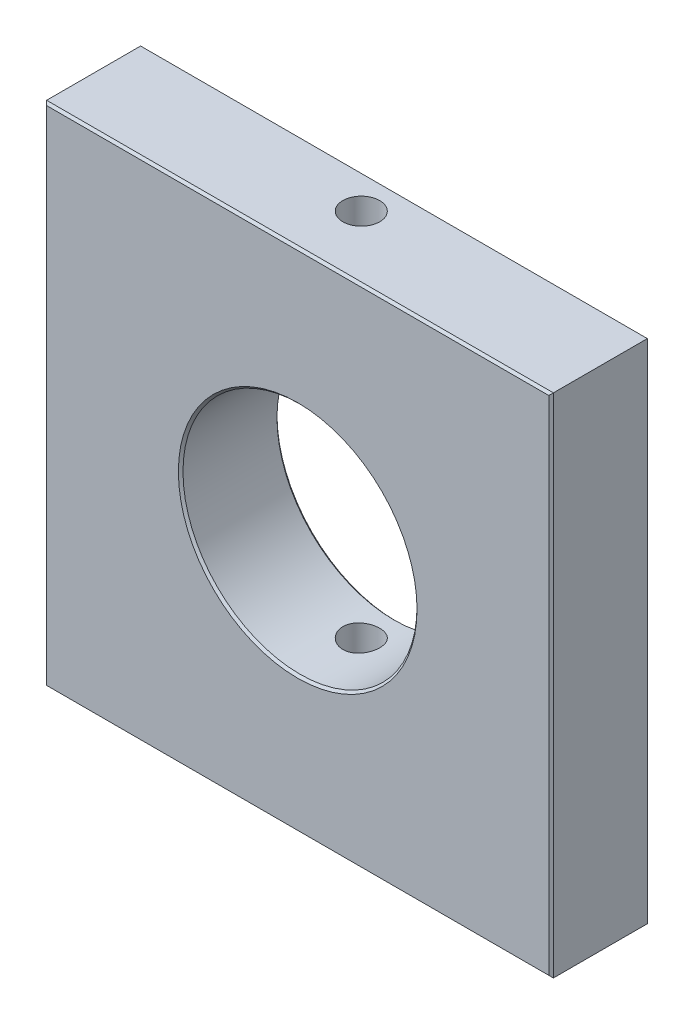
ISO-10303-21;
HEADER;
FILE_DESCRIPTION(('STEP AP214'),'2;1');
FILE_NAME('part.step','',(''),(''),'','','');
FILE_SCHEMA(('AUTOMOTIVE_DESIGN { 1 0 10303 214 1 1 1 1 }'));
ENDSEC;
DATA;
#1=APPLICATION_CONTEXT('core data for automotive mechanical design processes');
#2=APPLICATION_PROTOCOL_DEFINITION('international standard','automotive_design',2000,#1);
#3=PRODUCT_CONTEXT('',#1,'mechanical');
#4=PRODUCT('Part','Part','',(#3));
#5=PRODUCT_RELATED_PRODUCT_CATEGORY('part','',(#4));
#6=PRODUCT_DEFINITION_FORMATION('','',#4);
#7=PRODUCT_DEFINITION_CONTEXT('part definition',#1,'design');
#8=PRODUCT_DEFINITION('design','',#6,#7);
#9=PRODUCT_DEFINITION_SHAPE('','',#8);
#10=(LENGTH_UNIT() NAMED_UNIT(*) SI_UNIT(.MILLI.,.METRE.));
#11=(NAMED_UNIT(*) PLANE_ANGLE_UNIT() SI_UNIT($,.RADIAN.));
#12=(NAMED_UNIT(*) SI_UNIT($,.STERADIAN.) SOLID_ANGLE_UNIT());
#13=UNCERTAINTY_MEASURE_WITH_UNIT(LENGTH_MEASURE(1.E-05),#10,'distance_accuracy_value','');
#14=(GEOMETRIC_REPRESENTATION_CONTEXT(3) GLOBAL_UNCERTAINTY_ASSIGNED_CONTEXT((#13)) GLOBAL_UNIT_ASSIGNED_CONTEXT((#10,
#11,#12)) REPRESENTATION_CONTEXT('',''));
#15=CARTESIAN_POINT('',(0.,0.,0.));
#16=DIRECTION('',(0.,0.,1.));
#17=DIRECTION('',(1.,0.,0.));
#18=AXIS2_PLACEMENT_3D('',#15,#16,#17);
#19=CARTESIAN_POINT('',(0.,0.,10.7));
#20=DIRECTION('',(0.,0.,-1.));
#21=DIRECTION('',(-1.,0.,0.));
#22=AXIS2_PLACEMENT_3D('',#19,#20,#21);
#23=PLANE('',#22);
#24=CARTESIAN_POINT('',(0.,0.,10.7));
#25=DIRECTION('',(0.,0.,-1.));
#26=DIRECTION('',(-1.,0.,0.));
#27=AXIS2_PLACEMENT_3D('',#24,#25,#26);
#28=CIRCLE('',#27,12.95);
#29=CARTESIAN_POINT('',(-12.95,0.,10.7));
#30=VERTEX_POINT('',#29);
#31=EDGE_CURVE('E11',#30,#30,#28,.T.);
#32=ORIENTED_EDGE('',*,*,#31,.T.);
#33=EDGE_LOOP('',(#32));
#34=FACE_BOUND('',#33,.T.);
#35=DIRECTION('',(0.,-1.,0.));
#36=VECTOR('',#35,1.);
#37=CARTESIAN_POINT('',(-27.25,0.,10.7));
#38=LINE('',#37,#36);
#39=CARTESIAN_POINT('',(-27.25,27.25,10.7));
#40=VERTEX_POINT('',#39);
#41=CARTESIAN_POINT('',(-27.25,-27.25,10.7));
#42=VERTEX_POINT('',#41);
#43=EDGE_CURVE('E60',#40,#42,#38,.T.);
#44=ORIENTED_EDGE('',*,*,#43,.T.);
#45=DIRECTION('',(1.,0.,0.));
#46=VECTOR('',#45,1.);
#47=CARTESIAN_POINT('',(0.,-27.25,10.7));
#48=LINE('',#47,#46);
#49=CARTESIAN_POINT('',(27.25,-27.25,10.7));
#50=VERTEX_POINT('',#49);
#51=EDGE_CURVE('E52',#42,#50,#48,.T.);
#52=ORIENTED_EDGE('',*,*,#51,.T.);
#53=DIRECTION('',(0.,1.,0.));
#54=VECTOR('',#53,1.);
#55=CARTESIAN_POINT('',(27.25,0.,10.7));
#56=LINE('',#55,#54);
#57=CARTESIAN_POINT('',(27.25,27.25,10.7));
#58=VERTEX_POINT('',#57);
#59=EDGE_CURVE('E181',#50,#58,#56,.T.);
#60=ORIENTED_EDGE('',*,*,#59,.T.);
#61=DIRECTION('',(-1.,0.,0.));
#62=VECTOR('',#61,1.);
#63=CARTESIAN_POINT('',(0.,27.25,10.7));
#64=LINE('',#63,#62);
#65=EDGE_CURVE('E65',#58,#40,#64,.T.);
#66=ORIENTED_EDGE('',*,*,#65,.T.);
#67=EDGE_LOOP('',(#44,#52,#60,#66));
#68=FACE_BOUND('',#67,.T.);
#69=ADVANCED_FACE('F41',(#34,#68),#23,.F.);
#70=CARTESIAN_POINT('',(0.,0.,0.));
#71=DIRECTION('',(0.,0.,-1.));
#72=DIRECTION('',(-1.,0.,0.));
#73=AXIS2_PLACEMENT_3D('',#70,#71,#72);
#74=PLANE('',#73);
#75=CARTESIAN_POINT('',(0.,0.,0.));
#76=DIRECTION('',(0.,0.,-1.));
#77=DIRECTION('',(-1.,0.,0.));
#78=AXIS2_PLACEMENT_3D('',#75,#76,#77);
#79=CIRCLE('',#78,12.95);
#80=CARTESIAN_POINT('',(-12.95,0.,0.));
#81=VERTEX_POINT('',#80);
#82=EDGE_CURVE('E140',#81,#81,#79,.F.);
#83=ORIENTED_EDGE('',*,*,#82,.T.);
#84=EDGE_LOOP('',(#83));
#85=FACE_BOUND('',#84,.T.);
#86=DIRECTION('',(0.,1.,0.));
#87=VECTOR('',#86,1.);
#88=CARTESIAN_POINT('',(-27.25,27.5,0.));
#89=LINE('',#88,#87);
#90=CARTESIAN_POINT('',(-27.25,-27.25,0.));
#91=VERTEX_POINT('',#90);
#92=CARTESIAN_POINT('',(-27.25,27.25,0.));
#93=VERTEX_POINT('',#92);
#94=EDGE_CURVE('E138',#91,#93,#89,.T.);
#95=ORIENTED_EDGE('',*,*,#94,.T.);
#96=DIRECTION('',(1.,0.,0.));
#97=VECTOR('',#96,1.);
#98=CARTESIAN_POINT('',(27.5,27.25,0.));
#99=LINE('',#98,#97);
#100=CARTESIAN_POINT('',(27.25,27.25,0.));
#101=VERTEX_POINT('',#100);
#102=EDGE_CURVE('E115',#93,#101,#99,.T.);
#103=ORIENTED_EDGE('',*,*,#102,.T.);
#104=DIRECTION('',(0.,-1.,0.));
#105=VECTOR('',#104,1.);
#106=CARTESIAN_POINT('',(27.25,-27.5,0.));
#107=LINE('',#106,#105);
#108=CARTESIAN_POINT('',(27.25,-27.25,0.));
#109=VERTEX_POINT('',#108);
#110=EDGE_CURVE('E126',#101,#109,#107,.T.);
#111=ORIENTED_EDGE('',*,*,#110,.T.);
#112=DIRECTION('',(-1.,0.,0.));
#113=VECTOR('',#112,1.);
#114=CARTESIAN_POINT('',(-27.5,-27.25,0.));
#115=LINE('',#114,#113);
#116=EDGE_CURVE('E133',#109,#91,#115,.T.);
#117=ORIENTED_EDGE('',*,*,#116,.T.);
#118=EDGE_LOOP('',(#95,#103,#111,#117));
#119=FACE_BOUND('',#118,.T.);
#120=ADVANCED_FACE('F136',(#85,#119),#74,.T.);
#121=CARTESIAN_POINT('',(27.5,-27.5,10.7));
#122=DIRECTION('',(-1.,0.,0.));
#123=DIRECTION('',(0.,0.,1.));
#124=AXIS2_PLACEMENT_3D('',#121,#122,#123);
#125=PLANE('',#124);
#126=DIRECTION('',(0.,0.,-1.));
#127=VECTOR('',#126,1.);
#128=CARTESIAN_POINT('',(27.5,-27.5,10.7));
#129=LINE('',#128,#127);
#130=CARTESIAN_POINT('',(27.5,-27.5,10.45));
#131=VERTEX_POINT('',#130);
#132=CARTESIAN_POINT('',(27.5,-27.5,0.25));
#133=VERTEX_POINT('',#132);
#134=EDGE_CURVE('E460',#131,#133,#129,.T.);
#135=ORIENTED_EDGE('',*,*,#134,.T.);
#136=DIRECTION('',(0.,1.,0.));
#137=VECTOR('',#136,1.);
#138=CARTESIAN_POINT('',(27.5,27.5,0.25));
#139=LINE('',#138,#137);
#140=CARTESIAN_POINT('',(27.5,27.5,0.25));
#141=VERTEX_POINT('',#140);
#142=EDGE_CURVE('E178',#133,#141,#139,.T.);
#143=ORIENTED_EDGE('',*,*,#142,.T.);
#144=DIRECTION('',(0.,0.,-1.));
#145=VECTOR('',#144,1.);
#146=CARTESIAN_POINT('',(27.5,27.5,10.7));
#147=LINE('',#146,#145);
#148=CARTESIAN_POINT('',(27.5,27.5,10.45));
#149=VERTEX_POINT('',#148);
#150=EDGE_CURVE('E134',#149,#141,#147,.T.);
#151=ORIENTED_EDGE('',*,*,#150,.F.);
#152=DIRECTION('',(0.,-1.,0.));
#153=VECTOR('',#152,1.);
#154=CARTESIAN_POINT('',(27.5,-27.5,10.45));
#155=LINE('',#154,#153);
#156=EDGE_CURVE('E175',#149,#131,#155,.T.);
#157=ORIENTED_EDGE('',*,*,#156,.T.);
#158=EDGE_LOOP('',(#135,#143,#151,#157));
#159=FACE_BOUND('',#158,.T.);
#160=ADVANCED_FACE('F226',(#159),#125,.F.);
#161=CARTESIAN_POINT('',(-27.5,27.5,10.7));
#162=DIRECTION('',(0.,-1.,0.));
#163=DIRECTION('',(0.,0.,-1.));
#164=AXIS2_PLACEMENT_3D('',#161,#162,#163);
#165=PLANE('',#164);
#166=CARTESIAN_POINT('',(0.,27.5,3.8));
#167=DIRECTION('',(0.,1.,0.));
#168=DIRECTION('',(0.,0.,1.));
#169=AXIS2_PLACEMENT_3D('',#166,#167,#168);
#170=CIRCLE('',#169,2.);
#171=CARTESIAN_POINT('',(0.,27.5,5.8));
#172=VERTEX_POINT('',#171);
#173=EDGE_CURVE('E197',#172,#172,#170,.T.);
#174=ORIENTED_EDGE('',*,*,#173,.F.);
#175=EDGE_LOOP('',(#174));
#176=FACE_BOUND('',#175,.T.);
#177=ORIENTED_EDGE('',*,*,#150,.T.);
#178=DIRECTION('',(-1.,0.,0.));
#179=VECTOR('',#178,1.);
#180=CARTESIAN_POINT('',(-27.5,27.5,0.25));
#181=LINE('',#180,#179);
#182=CARTESIAN_POINT('',(-27.5,27.5,0.25));
#183=VERTEX_POINT('',#182);
#184=EDGE_CURVE('E118',#141,#183,#181,.T.);
#185=ORIENTED_EDGE('',*,*,#184,.T.);
#186=DIRECTION('',(0.,0.,-1.));
#187=VECTOR('',#186,1.);
#188=CARTESIAN_POINT('',(-27.5,27.5,10.7));
#189=LINE('',#188,#187);
#190=CARTESIAN_POINT('',(-27.5,27.5,10.45));
#191=VERTEX_POINT('',#190);
#192=EDGE_CURVE('E223',#191,#183,#189,.T.);
#193=ORIENTED_EDGE('',*,*,#192,.F.);
#194=DIRECTION('',(1.,0.,0.));
#195=VECTOR('',#194,1.);
#196=CARTESIAN_POINT('',(-27.5,27.5,10.45));
#197=LINE('',#196,#195);
#198=EDGE_CURVE('E157',#191,#149,#197,.T.);
#199=ORIENTED_EDGE('',*,*,#198,.T.);
#200=EDGE_LOOP('',(#177,#185,#193,#199));
#201=FACE_BOUND('',#200,.T.);
#202=ADVANCED_FACE('F221',(#176,#201),#165,.F.);
#203=CARTESIAN_POINT('',(-27.5,-27.5,10.7));
#204=DIRECTION('',(1.,0.,0.));
#205=DIRECTION('',(0.,0.,-1.));
#206=AXIS2_PLACEMENT_3D('',#203,#204,#205);
#207=PLANE('',#206);
#208=ORIENTED_EDGE('',*,*,#192,.T.);
#209=DIRECTION('',(0.,-1.,0.));
#210=VECTOR('',#209,1.);
#211=CARTESIAN_POINT('',(-27.5,-27.5,0.25));
#212=LINE('',#211,#210);
#213=CARTESIAN_POINT('',(-27.5,-27.5,0.25));
#214=VERTEX_POINT('',#213);
#215=EDGE_CURVE('E165',#183,#214,#212,.T.);
#216=ORIENTED_EDGE('',*,*,#215,.T.);
#217=DIRECTION('',(0.,0.,-1.));
#218=VECTOR('',#217,1.);
#219=CARTESIAN_POINT('',(-27.5,-27.5,10.7));
#220=LINE('',#219,#218);
#221=CARTESIAN_POINT('',(-27.5,-27.5,10.45));
#222=VERTEX_POINT('',#221);
#223=EDGE_CURVE('E231',#222,#214,#220,.T.);
#224=ORIENTED_EDGE('',*,*,#223,.F.);
#225=DIRECTION('',(0.,1.,0.));
#226=VECTOR('',#225,1.);
#227=CARTESIAN_POINT('',(-27.5,-27.5,10.45));
#228=LINE('',#227,#226);
#229=EDGE_CURVE('E162',#222,#191,#228,.T.);
#230=ORIENTED_EDGE('',*,*,#229,.T.);
#231=EDGE_LOOP('',(#208,#216,#224,#230));
#232=FACE_BOUND('',#231,.T.);
#233=ADVANCED_FACE('F277',(#232),#207,.F.);
#234=CARTESIAN_POINT('',(-27.5,-27.5,10.7));
#235=DIRECTION('',(0.,1.,0.));
#236=DIRECTION('',(0.,0.,1.));
#237=AXIS2_PLACEMENT_3D('',#234,#235,#236);
#238=PLANE('',#237);
#239=CARTESIAN_POINT('',(0.,-27.5,3.8));
#240=DIRECTION('',(0.,1.,0.));
#241=DIRECTION('',(0.,0.,1.));
#242=AXIS2_PLACEMENT_3D('',#239,#240,#241);
#243=CIRCLE('',#242,2.);
#244=CARTESIAN_POINT('',(0.,-27.5,5.8));
#245=VERTEX_POINT('',#244);
#246=EDGE_CURVE('E245',#245,#245,#243,.T.);
#247=ORIENTED_EDGE('',*,*,#246,.T.);
#248=EDGE_LOOP('',(#247));
#249=FACE_BOUND('',#248,.T.);
#250=ORIENTED_EDGE('',*,*,#223,.T.);
#251=DIRECTION('',(1.,0.,0.));
#252=VECTOR('',#251,1.);
#253=CARTESIAN_POINT('',(27.5,-27.5,0.25));
#254=LINE('',#253,#252);
#255=EDGE_CURVE('E172',#214,#133,#254,.T.);
#256=ORIENTED_EDGE('',*,*,#255,.T.);
#257=ORIENTED_EDGE('',*,*,#134,.F.);
#258=DIRECTION('',(-1.,0.,0.));
#259=VECTOR('',#258,1.);
#260=CARTESIAN_POINT('',(-27.5,-27.5,10.45));
#261=LINE('',#260,#259);
#262=EDGE_CURVE('E168',#131,#222,#261,.T.);
#263=ORIENTED_EDGE('',*,*,#262,.T.);
#264=EDGE_LOOP('',(#250,#256,#257,#263));
#265=FACE_BOUND('',#264,.T.);
#266=ADVANCED_FACE('F264',(#249,#265),#238,.F.);
#267=CARTESIAN_POINT('',(0.,0.,10.7));
#268=DIRECTION('',(0.,0.,-1.));
#269=DIRECTION('',(-1.,0.,0.));
#270=AXIS2_PLACEMENT_3D('',#267,#268,#269);
#271=CYLINDRICAL_SURFACE('',#270,12.7);
#272=CARTESIAN_POINT('',(0.,0.,0.250000000000011));
#273=DIRECTION('',(0.,0.,-1.));
#274=DIRECTION('',(-1.,0.,0.));
#275=AXIS2_PLACEMENT_3D('',#272,#273,#274);
#276=CIRCLE('',#275,12.7);
#277=CARTESIAN_POINT('',(-12.7,0.,0.250000000000011));
#278=VERTEX_POINT('',#277);
#279=EDGE_CURVE('E153',#278,#278,#276,.T.);
#280=ORIENTED_EDGE('',*,*,#279,.T.);
#281=EDGE_LOOP('',(#280));
#282=FACE_BOUND('',#281,.T.);
#283=CARTESIAN_POINT('',(0.,0.,10.45));
#284=DIRECTION('',(0.,0.,-1.));
#285=DIRECTION('',(-1.,0.,0.));
#286=AXIS2_PLACEMENT_3D('',#283,#284,#285);
#287=CIRCLE('',#286,12.7);
#288=CARTESIAN_POINT('',(-12.7,0.,10.45));
#289=VERTEX_POINT('',#288);
#290=EDGE_CURVE('E145',#289,#289,#287,.F.);
#291=ORIENTED_EDGE('',*,*,#290,.T.);
#292=EDGE_LOOP('',(#291));
#293=FACE_BOUND('',#292,.T.);
#294=CARTESIAN_POINT('',(0.,-12.7,5.8));
#295=CARTESIAN_POINT('',(0.111600664148431,-12.6999981524228,5.79999545104187));
#296=CARTESIAN_POINT('',(0.223264408691944,-12.6985135958241,5.79062742468302));
#297=CARTESIAN_POINT('',(0.443466081735364,-12.6927343158842,5.75341497965549));
#298=CARTESIAN_POINT('',(0.552000938104321,-12.688436922686,5.72555300675381));
#299=CARTESIAN_POINT('',(0.762726600203343,-12.6775144984945,5.65220975884927));
#300=CARTESIAN_POINT('',(0.864922301127025,-12.6708912905376,5.60674228065987));
#301=CARTESIAN_POINT('',(1.06021942005788,-12.656047516791,5.49951346482873));
#302=CARTESIAN_POINT('',(1.15332200133802,-12.6478271557265,5.43775421512671));
#303=CARTESIAN_POINT('',(1.32860297056712,-12.6306231344999,5.2991310475032));
#304=CARTESIAN_POINT('',(1.41069206722919,-12.6216341021079,5.22215488066347));
#305=CARTESIAN_POINT('',(1.56084506439828,-12.6039474984593,5.05552453918275));
#306=CARTESIAN_POINT('',(1.62890812473979,-12.5952499446885,4.96586960562036));
#307=CARTESIAN_POINT('',(1.74942910866078,-12.5790789996388,4.77582082402101));
#308=CARTESIAN_POINT('',(1.80179980015071,-12.5716125514922,4.67537101488049));
#309=CARTESIAN_POINT('',(1.88889181156734,-12.5588230882536,4.46696339355125));
#310=CARTESIAN_POINT('',(1.9236141931795,-12.5534999442289,4.3590060334454));
#311=CARTESIAN_POINT('',(1.97414485466214,-12.5456529167489,4.13959024617506));
#312=CARTESIAN_POINT('',(1.99010658054076,-12.5431063360034,4.02816798385193));
#313=CARTESIAN_POINT('',(2.00313837228686,-12.5410319744817,3.80419971379784));
#314=CARTESIAN_POINT('',(2.00020963248389,-12.5415040028571,3.69165377755916));
#315=CARTESIAN_POINT('',(1.97566884734412,-12.5453927846462,3.46972184809287));
#316=CARTESIAN_POINT('',(1.9542283431422,-12.5487825001334,3.3603163438682));
#317=CARTESIAN_POINT('',(1.89354147195399,-12.5580824469318,3.14667521604141));
#318=CARTESIAN_POINT('',(1.85429455435304,-12.563992756185,3.04243975241923));
#319=CARTESIAN_POINT('',(1.75893248532883,-12.5776975271031,2.84157930504981));
#320=CARTESIAN_POINT('',(1.70274529763056,-12.5855000066881,2.74498909131562));
#321=CARTESIAN_POINT('',(1.57514886920774,-12.6021042826765,2.56254284319698));
#322=CARTESIAN_POINT('',(1.50373852907517,-12.6109061512339,2.4766875847962));
#323=CARTESIAN_POINT('',(1.34678429864889,-12.6286366346194,2.31715470501894));
#324=CARTESIAN_POINT('',(1.2610930547786,-12.6375655758177,2.24362201447366));
#325=CARTESIAN_POINT('',(1.07851000708309,-12.6544540651169,2.1119585439421));
#326=CARTESIAN_POINT('',(0.981618144707529,-12.6624136081499,2.05382784447374));
#327=CARTESIAN_POINT('',(0.779253998051945,-12.6764760534843,1.95460852651786));
#328=CARTESIAN_POINT('',(0.673775789064685,-12.6825776597812,1.91353179680819));
#329=CARTESIAN_POINT('',(0.457300496976724,-12.6922261116509,1.84971613464688));
#330=CARTESIAN_POINT('',(0.346303826181981,-12.6957731477799,1.8269758343879));
#331=CARTESIAN_POINT('',(0.123192515262891,-12.6998873989399,1.80067289949186));
#332=CARTESIAN_POINT('',(0.0111019000102471,-12.7004855521301,1.79691114195413));
#333=CARTESIAN_POINT('',(-0.212108799245061,-12.6987190855452,1.80814252217226));
#334=CARTESIAN_POINT('',(-0.323228916331892,-12.6963545671673,1.82313501806512));
#335=CARTESIAN_POINT('',(-0.540735984090567,-12.6889475760288,1.87128372017386));
#336=CARTESIAN_POINT('',(-0.647145094524473,-12.6839195116251,1.90434222907606));
#337=CARTESIAN_POINT('',(-0.852910537175738,-12.6717471746444,1.98758103196953));
#338=CARTESIAN_POINT('',(-0.952266509022135,-12.6646027940332,2.03776220006131));
#339=CARTESIAN_POINT('',(-1.14197626986114,-12.6489143053637,2.1542841669279));
#340=CARTESIAN_POINT('',(-1.23225209209936,-12.64035950645,2.22075043715911));
#341=CARTESIAN_POINT('',(-1.40043925638692,-12.6228338045793,2.36778210264794));
#342=CARTESIAN_POINT('',(-1.47834980144401,-12.6138628748489,2.44834840600671));
#343=CARTESIAN_POINT('',(-1.62032529447352,-12.5964170389827,2.62218254290549));
#344=CARTESIAN_POINT('',(-1.68425629390624,-12.5879474544687,2.71556039281225));
#345=CARTESIAN_POINT('',(-1.79552493875651,-12.5725597460065,2.91184675186261));
#346=CARTESIAN_POINT('',(-1.84286306759368,-12.5656415768612,3.01475498323596));
#347=CARTESIAN_POINT('',(-1.91939776922027,-12.5541791497608,3.22679237146338));
#348=CARTESIAN_POINT('',(-1.94866316332215,-12.5496258968279,3.33589617939465));
#349=CARTESIAN_POINT('',(-1.98843966512351,-12.5433855077099,3.55754786487889));
#350=CARTESIAN_POINT('',(-1.99895221290397,-12.5416981514454,3.67009547729775));
#351=CARTESIAN_POINT('',(-2.00088776475511,-12.5413893815232,3.89410381943855));
#352=CARTESIAN_POINT('',(-1.99252147376704,-12.5427341267358,4.00556273860851));
#353=CARTESIAN_POINT('',(-1.95739014761224,-12.5482642234243,4.22546672448931));
#354=CARTESIAN_POINT('',(-1.93062515445397,-12.5524495684144,4.33391179808085));
#355=CARTESIAN_POINT('',(-1.8595334344723,-12.5631769993357,4.54464124298767));
#356=CARTESIAN_POINT('',(-1.81522293072758,-12.569716907665,4.64693120512874));
#357=CARTESIAN_POINT('',(-1.71031923483932,-12.5844189839644,4.84265934283271));
#358=CARTESIAN_POINT('',(-1.6497253785591,-12.5925812180996,4.93609715713953));
#359=CARTESIAN_POINT('',(-1.51321535288378,-12.609716418747,5.11253660758065));
#360=CARTESIAN_POINT('',(-1.4371435662029,-12.6186970623269,5.19541711351072));
#361=CARTESIAN_POINT('',(-1.27216585168972,-12.6363943544853,5.34730993435494));
#362=CARTESIAN_POINT('',(-1.18325695526795,-12.645110941435,5.41631903264325));
#363=CARTESIAN_POINT('',(-0.994487066672457,-12.6613592038177,5.53889057092499));
#364=CARTESIAN_POINT('',(-0.894562527845794,-12.6688833207732,5.59235614060556));
#365=CARTESIAN_POINT('',(-0.687076932420277,-12.6818250857032,5.68166300168163));
#366=CARTESIAN_POINT('',(-0.579523781530769,-12.6872448777818,5.71752224213883));
#367=CARTESIAN_POINT('',(-0.392929714532194,-12.6941538178297,5.76261624984703));
#368=CARTESIAN_POINT('',(-0.3150309161386,-12.6963346778751,5.77661328739818));
#369=CARTESIAN_POINT('',(-0.158098621405056,-12.699258413071,5.79530670685025));
#370=CARTESIAN_POINT('',(-0.0790651414330078,-12.7000013089434,5.80000322277668));
#371=CARTESIAN_POINT('',(0.,-12.7,5.8));
#372=B_SPLINE_CURVE_WITH_KNOTS('',3,(#294,#295,#296,#297,#298,#299,#300,#301,#302,#303,#304,
#305,#306,#307,#308,#309,#310,#311,#312,#313,#314,#315,#316,#317,#318,#319,#320,#321,#322,#323,
#324,#325,#326,#327,#328,#329,#330,#331,#332,#333,#334,#335,#336,#337,#338,#339,#340,#341,#342,
#343,#344,#345,#346,#347,#348,#349,#350,#351,#352,#353,#354,#355,#356,#357,#358,#359,#360,#361,
#362,#363,#364,#365,#366,#367,#368,#369,#370,#371),.UNSPECIFIED.,.T.,.F.,(4,2,2,2,2,2,2,2,2,2,2,
2,2,2,2,2,2,2,2,2,2,2,2,2,2,2,2,2,2,2,2,2,2,2,2,2,2,2,4),(0.,0.334513039604495,
0.669344049903146,1.00391319427767,1.33843948136658,1.67553227840721,2.0126452615833,
2.35159886049296,2.69053206624813,3.02667336088651,3.36279340355811,3.69583178246361,
4.02888046037267,4.36336585230724,4.69787540878863,5.03607855788055,5.37428347498268,
5.71272376947474,6.05113881565149,6.38599571658059,6.72084115736918,7.05389348767034,
7.38696282261843,7.72268383084116,8.05842646886413,8.39725738316846,8.73607842509268,
9.07360114302579,9.4110979405752,9.74484662182495,10.0785945410525,10.4120345853634,
10.7454882315036,11.0824767022769,11.4195432270249,11.758667468913,12.0974452634267,
12.3344393900488,12.5714301014333),.UNSPECIFIED.);
#373=CARTESIAN_POINT('',(0.,-12.7,5.8));
#374=VERTEX_POINT('',#373);
#375=EDGE_CURVE('E244',#374,#374,#372,.T.);
#376=ORIENTED_EDGE('',*,*,#375,.F.);
#377=EDGE_LOOP('',(#376));
#378=FACE_BOUND('',#377,.T.);
#379=CARTESIAN_POINT('',(0.,12.7,5.8));
#380=CARTESIAN_POINT('',(-0.111600664148431,12.6999981524228,5.79999545104187));
#381=CARTESIAN_POINT('',(-0.223264408691944,12.6985135958241,5.79062742468302));
#382=CARTESIAN_POINT('',(-0.443466081735364,12.6927343158842,5.75341497965549));
#383=CARTESIAN_POINT('',(-0.552000938104321,12.688436922686,5.72555300675381));
#384=CARTESIAN_POINT('',(-0.762726600203343,12.6775144984945,5.65220975884927));
#385=CARTESIAN_POINT('',(-0.864922301127025,12.6708912905376,5.60674228065987));
#386=CARTESIAN_POINT('',(-1.06021942005788,12.656047516791,5.49951346482873));
#387=CARTESIAN_POINT('',(-1.15332200133802,12.6478271557265,5.43775421512671));
#388=CARTESIAN_POINT('',(-1.32860297056712,12.6306231344999,5.2991310475032));
#389=CARTESIAN_POINT('',(-1.41069206722919,12.6216341021079,5.22215488066347));
#390=CARTESIAN_POINT('',(-1.56084506439828,12.6039474984593,5.05552453918275));
#391=CARTESIAN_POINT('',(-1.62890812473979,12.5952499446885,4.96586960562036));
#392=CARTESIAN_POINT('',(-1.74942910866078,12.5790789996388,4.77582082402101));
#393=CARTESIAN_POINT('',(-1.80179980015071,12.5716125514922,4.67537101488049));
#394=CARTESIAN_POINT('',(-1.88889181156734,12.5588230882536,4.46696339355125));
#395=CARTESIAN_POINT('',(-1.9236141931795,12.5534999442289,4.3590060334454));
#396=CARTESIAN_POINT('',(-1.97414485466214,12.5456529167489,4.13959024617506));
#397=CARTESIAN_POINT('',(-1.99010658054076,12.5431063360034,4.02816798385193));
#398=CARTESIAN_POINT('',(-2.00313837228686,12.5410319744817,3.80419971379784));
#399=CARTESIAN_POINT('',(-2.00020963248389,12.5415040028571,3.69165377755916));
#400=CARTESIAN_POINT('',(-1.97566884734412,12.5453927846462,3.46972184809287));
#401=CARTESIAN_POINT('',(-1.9542283431422,12.5487825001334,3.3603163438682));
#402=CARTESIAN_POINT('',(-1.89354147195399,12.5580824469318,3.14667521604141));
#403=CARTESIAN_POINT('',(-1.85429455435304,12.563992756185,3.04243975241923));
#404=CARTESIAN_POINT('',(-1.75893248532883,12.5776975271031,2.84157930504981));
#405=CARTESIAN_POINT('',(-1.70274529763056,12.5855000066881,2.74498909131562));
#406=CARTESIAN_POINT('',(-1.57514886920774,12.6021042826765,2.56254284319698));
#407=CARTESIAN_POINT('',(-1.50373852907517,12.6109061512339,2.4766875847962));
#408=CARTESIAN_POINT('',(-1.34678429864889,12.6286366346194,2.31715470501894));
#409=CARTESIAN_POINT('',(-1.2610930547786,12.6375655758177,2.24362201447366));
#410=CARTESIAN_POINT('',(-1.07851000708309,12.6544540651169,2.1119585439421));
#411=CARTESIAN_POINT('',(-0.981618144707529,12.6624136081499,2.05382784447374));
#412=CARTESIAN_POINT('',(-0.779253998051945,12.6764760534843,1.95460852651786));
#413=CARTESIAN_POINT('',(-0.673775789064685,12.6825776597812,1.91353179680819));
#414=CARTESIAN_POINT('',(-0.457300496976724,12.6922261116509,1.84971613464688));
#415=CARTESIAN_POINT('',(-0.346303826181981,12.6957731477799,1.8269758343879));
#416=CARTESIAN_POINT('',(-0.123192515262891,12.6998873989399,1.80067289949186));
#417=CARTESIAN_POINT('',(-0.0111019000102471,12.7004855521301,1.79691114195413));
#418=CARTESIAN_POINT('',(0.212108799245061,12.6987190855452,1.80814252217226));
#419=CARTESIAN_POINT('',(0.323228916331892,12.6963545671673,1.82313501806512));
#420=CARTESIAN_POINT('',(0.540735984090567,12.6889475760288,1.87128372017386));
#421=CARTESIAN_POINT('',(0.647145094524473,12.6839195116251,1.90434222907606));
#422=CARTESIAN_POINT('',(0.852910537175738,12.6717471746444,1.98758103196953));
#423=CARTESIAN_POINT('',(0.952266509022135,12.6646027940332,2.03776220006131));
#424=CARTESIAN_POINT('',(1.14197626986114,12.6489143053637,2.1542841669279));
#425=CARTESIAN_POINT('',(1.23225209209936,12.64035950645,2.22075043715911));
#426=CARTESIAN_POINT('',(1.40043925638692,12.6228338045793,2.36778210264794));
#427=CARTESIAN_POINT('',(1.47834980144401,12.6138628748489,2.44834840600671));
#428=CARTESIAN_POINT('',(1.62032529447352,12.5964170389827,2.62218254290549));
#429=CARTESIAN_POINT('',(1.68425629390624,12.5879474544687,2.71556039281225));
#430=CARTESIAN_POINT('',(1.79552493875651,12.5725597460065,2.91184675186261));
#431=CARTESIAN_POINT('',(1.84286306759368,12.5656415768612,3.01475498323596));
#432=CARTESIAN_POINT('',(1.91939776922027,12.5541791497608,3.22679237146338));
#433=CARTESIAN_POINT('',(1.94866316332215,12.5496258968279,3.33589617939465));
#434=CARTESIAN_POINT('',(1.98843966512351,12.5433855077099,3.55754786487889));
#435=CARTESIAN_POINT('',(1.99895221290397,12.5416981514454,3.67009547729775));
#436=CARTESIAN_POINT('',(2.00088776475511,12.5413893815232,3.89410381943855));
#437=CARTESIAN_POINT('',(1.99252147376704,12.5427341267358,4.00556273860851));
#438=CARTESIAN_POINT('',(1.95739014761224,12.5482642234243,4.22546672448931));
#439=CARTESIAN_POINT('',(1.93062515445397,12.5524495684144,4.33391179808085));
#440=CARTESIAN_POINT('',(1.8595334344723,12.5631769993357,4.54464124298767));
#441=CARTESIAN_POINT('',(1.81522293072758,12.569716907665,4.64693120512874));
#442=CARTESIAN_POINT('',(1.71031923483932,12.5844189839644,4.84265934283271));
#443=CARTESIAN_POINT('',(1.6497253785591,12.5925812180996,4.93609715713953));
#444=CARTESIAN_POINT('',(1.51321535288378,12.609716418747,5.11253660758065));
#445=CARTESIAN_POINT('',(1.4371435662029,12.6186970623269,5.19541711351072));
#446=CARTESIAN_POINT('',(1.27216585168972,12.6363943544853,5.34730993435494));
#447=CARTESIAN_POINT('',(1.18325695526795,12.645110941435,5.41631903264325));
#448=CARTESIAN_POINT('',(0.994487066672457,12.6613592038177,5.53889057092499));
#449=CARTESIAN_POINT('',(0.894562527845794,12.6688833207732,5.59235614060556));
#450=CARTESIAN_POINT('',(0.687076932420277,12.6818250857032,5.68166300168163));
#451=CARTESIAN_POINT('',(0.579523781530769,12.6872448777818,5.71752224213883));
#452=CARTESIAN_POINT('',(0.392929714532194,12.6941538178297,5.76261624984703));
#453=CARTESIAN_POINT('',(0.3150309161386,12.6963346778751,5.77661328739818));
#454=CARTESIAN_POINT('',(0.158098621405056,12.699258413071,5.79530670685025));
#455=CARTESIAN_POINT('',(0.0790651414330078,12.7000013089434,5.80000322277668));
#456=CARTESIAN_POINT('',(0.,12.7,5.8));
#457=B_SPLINE_CURVE_WITH_KNOTS('',3,(#379,#380,#381,#382,#383,#384,#385,#386,#387,#388,#389,
#390,#391,#392,#393,#394,#395,#396,#397,#398,#399,#400,#401,#402,#403,#404,#405,#406,#407,#408,
#409,#410,#411,#412,#413,#414,#415,#416,#417,#418,#419,#420,#421,#422,#423,#424,#425,#426,#427,
#428,#429,#430,#431,#432,#433,#434,#435,#436,#437,#438,#439,#440,#441,#442,#443,#444,#445,#446,
#447,#448,#449,#450,#451,#452,#453,#454,#455,#456),.UNSPECIFIED.,.T.,.F.,(4,2,2,2,2,2,2,2,2,2,2,
2,2,2,2,2,2,2,2,2,2,2,2,2,2,2,2,2,2,2,2,2,2,2,2,2,2,2,4),(0.,0.334513039604495,
0.669344049903146,1.00391319427767,1.33843948136658,1.67553227840721,2.0126452615833,
2.35159886049296,2.69053206624813,3.02667336088651,3.36279340355811,3.69583178246361,
4.02888046037267,4.36336585230724,4.69787540878863,5.03607855788055,5.37428347498268,
5.71272376947474,6.05113881565149,6.38599571658059,6.72084115736918,7.05389348767034,
7.38696282261843,7.72268383084116,8.05842646886413,8.39725738316846,8.73607842509268,
9.07360114302579,9.4110979405752,9.74484662182495,10.0785945410525,10.4120345853634,
10.7454882315036,11.0824767022769,11.4195432270249,11.758667468913,12.0974452634267,
12.3344393900488,12.5714301014333),.UNSPECIFIED.);
#458=CARTESIAN_POINT('',(0.,12.7,5.8));
#459=VERTEX_POINT('',#458);
#460=EDGE_CURVE('E235',#459,#459,#457,.T.);
#461=ORIENTED_EDGE('',*,*,#460,.F.);
#462=EDGE_LOOP('',(#461));
#463=FACE_BOUND('',#462,.T.);
#464=ADVANCED_FACE('F249',(#282,#293,#378,#463),#271,.F.);
#465=CARTESIAN_POINT('',(0.,-27.5,3.8));
#466=DIRECTION('',(0.,1.,0.));
#467=DIRECTION('',(0.,0.,1.));
#468=AXIS2_PLACEMENT_3D('',#465,#466,#467);
#469=CYLINDRICAL_SURFACE('',#468,2.);
#470=ORIENTED_EDGE('',*,*,#460,.T.);
#471=EDGE_LOOP('',(#470));
#472=FACE_BOUND('',#471,.T.);
#473=ORIENTED_EDGE('',*,*,#173,.T.);
#474=EDGE_LOOP('',(#473));
#475=FACE_BOUND('',#474,.T.);
#476=ADVANCED_FACE('F252',(#472,#475),#469,.F.);
#477=ORIENTED_EDGE('',*,*,#375,.T.);
#478=EDGE_LOOP('',(#477));
#479=FACE_BOUND('',#478,.T.);
#480=ORIENTED_EDGE('',*,*,#246,.F.);
#481=EDGE_LOOP('',(#480));
#482=FACE_BOUND('',#481,.T.);
#483=ADVANCED_FACE('F255',(#479,#482),#469,.F.);
#484=CARTESIAN_POINT('',(0.,0.,0.));
#485=DIRECTION('',(0.,0.,-1.));
#486=DIRECTION('',(-1.,0.,0.));
#487=AXIS2_PLACEMENT_3D('',#484,#485,#486);
#488=CONICAL_SURFACE('',#487,12.95,0.785398163397434);
#489=ORIENTED_EDGE('',*,*,#279,.F.);
#490=EDGE_LOOP('',(#489));
#491=FACE_BOUND('',#490,.T.);
#492=ORIENTED_EDGE('',*,*,#82,.F.);
#493=EDGE_LOOP('',(#492));
#494=FACE_BOUND('',#493,.T.);
#495=ADVANCED_FACE('F262',(#491,#494),#488,.F.);
#496=CARTESIAN_POINT('',(-27.5,-27.5,0.25));
#497=DIRECTION('',(0.,-0.707106781186547,-0.707106781186547));
#498=DIRECTION('',(-1.,0.,0.));
#499=AXIS2_PLACEMENT_3D('',#496,#497,#498);
#500=PLANE('',#499);
#501=DIRECTION('',(0.577350269189626,0.577350269189626,-0.577350269189626));
#502=VECTOR('',#501,1.);
#503=CARTESIAN_POINT('',(-27.5,-27.5,0.25));
#504=LINE('',#503,#502);
#505=EDGE_CURVE('E122',#91,#214,#504,.F.);
#506=ORIENTED_EDGE('',*,*,#505,.F.);
#507=ORIENTED_EDGE('',*,*,#116,.F.);
#508=DIRECTION('',(-0.577350269189626,0.577350269189626,-0.577350269189626));
#509=VECTOR('',#508,1.);
#510=CARTESIAN_POINT('',(27.5,-27.5,0.25));
#511=LINE('',#510,#509);
#512=EDGE_CURVE('E129',#133,#109,#511,.T.);
#513=ORIENTED_EDGE('',*,*,#512,.F.);
#514=ORIENTED_EDGE('',*,*,#255,.F.);
#515=EDGE_LOOP('',(#506,#507,#513,#514));
#516=FACE_BOUND('',#515,.T.);
#517=ADVANCED_FACE('F293',(#516),#500,.T.);
#518=CARTESIAN_POINT('',(27.5,-27.5,0.25));
#519=DIRECTION('',(0.707106781186547,0.,-0.707106781186547));
#520=DIRECTION('',(0.,-1.,0.));
#521=AXIS2_PLACEMENT_3D('',#518,#519,#520);
#522=PLANE('',#521);
#523=ORIENTED_EDGE('',*,*,#512,.T.);
#524=ORIENTED_EDGE('',*,*,#110,.F.);
#525=DIRECTION('',(0.577350269189626,0.577350269189626,0.577350269189626));
#526=VECTOR('',#525,1.);
#527=CARTESIAN_POINT('',(9.16666666666666,9.16666666666667,-18.0833333333333));
#528=LINE('',#527,#526);
#529=EDGE_CURVE('E111',#141,#101,#528,.F.);
#530=ORIENTED_EDGE('',*,*,#529,.F.);
#531=ORIENTED_EDGE('',*,*,#142,.F.);
#532=EDGE_LOOP('',(#523,#524,#530,#531));
#533=FACE_BOUND('',#532,.T.);
#534=ADVANCED_FACE('F127',(#533),#522,.T.);
#535=CARTESIAN_POINT('',(-27.5,-27.5,0.25));
#536=DIRECTION('',(-0.707106781186547,0.,-0.707106781186547));
#537=DIRECTION('',(0.,1.,0.));
#538=AXIS2_PLACEMENT_3D('',#535,#536,#537);
#539=PLANE('',#538);
#540=ORIENTED_EDGE('',*,*,#505,.T.);
#541=ORIENTED_EDGE('',*,*,#215,.F.);
#542=DIRECTION('',(0.577350269189626,-0.577350269189626,-0.577350269189626));
#543=VECTOR('',#542,1.);
#544=CARTESIAN_POINT('',(-9.16666666666667,9.16666666666667,-18.0833333333333));
#545=LINE('',#544,#543);
#546=EDGE_CURVE('E123',#93,#183,#545,.F.);
#547=ORIENTED_EDGE('',*,*,#546,.F.);
#548=ORIENTED_EDGE('',*,*,#94,.F.);
#549=EDGE_LOOP('',(#540,#541,#547,#548));
#550=FACE_BOUND('',#549,.T.);
#551=ADVANCED_FACE('F303',(#550),#539,.T.);
#552=CARTESIAN_POINT('',(-27.5,27.5,0.25));
#553=DIRECTION('',(0.,0.707106781186547,-0.707106781186547));
#554=DIRECTION('',(1.,0.,0.));
#555=AXIS2_PLACEMENT_3D('',#552,#553,#554);
#556=PLANE('',#555);
#557=ORIENTED_EDGE('',*,*,#529,.T.);
#558=ORIENTED_EDGE('',*,*,#102,.F.);
#559=ORIENTED_EDGE('',*,*,#546,.T.);
#560=ORIENTED_EDGE('',*,*,#184,.F.);
#561=EDGE_LOOP('',(#557,#558,#559,#560));
#562=FACE_BOUND('',#561,.T.);
#563=ADVANCED_FACE('F113',(#562),#556,.T.);
#564=CARTESIAN_POINT('',(0.,0.,10.45));
#565=DIRECTION('',(0.,0.,1.));
#566=DIRECTION('',(1.,0.,0.));
#567=AXIS2_PLACEMENT_3D('',#564,#565,#566);
#568=CONICAL_SURFACE('',#567,12.7,0.785398163397448);
#569=ORIENTED_EDGE('',*,*,#31,.F.);
#570=EDGE_LOOP('',(#569));
#571=FACE_BOUND('',#570,.T.);
#572=ORIENTED_EDGE('',*,*,#290,.F.);
#573=EDGE_LOOP('',(#572));
#574=FACE_BOUND('',#573,.T.);
#575=ADVANCED_FACE('F302',(#571,#574),#568,.F.);
#576=CARTESIAN_POINT('',(0.,27.25,10.7));
#577=DIRECTION('',(0.,-0.707106781186547,-0.707106781186547));
#578=DIRECTION('',(-1.,0.,0.));
#579=AXIS2_PLACEMENT_3D('',#576,#577,#578);
#580=PLANE('',#579);
#581=DIRECTION('',(-0.577350269189626,-0.577350269189626,0.577350269189626));
#582=VECTOR('',#581,1.);
#583=CARTESIAN_POINT('',(18.1666666666667,18.1666666666667,19.7833333333333));
#584=LINE('',#583,#582);
#585=EDGE_CURVE('E203',#149,#58,#584,.T.);
#586=ORIENTED_EDGE('',*,*,#585,.F.);
#587=ORIENTED_EDGE('',*,*,#198,.F.);
#588=DIRECTION('',(0.577350269189626,-0.577350269189626,0.577350269189626));
#589=VECTOR('',#588,1.);
#590=CARTESIAN_POINT('',(-18.1666666666667,18.1666666666667,19.7833333333333));
#591=LINE('',#590,#589);
#592=EDGE_CURVE('E46',#40,#191,#591,.F.);
#593=ORIENTED_EDGE('',*,*,#592,.F.);
#594=ORIENTED_EDGE('',*,*,#65,.F.);
#595=EDGE_LOOP('',(#586,#587,#593,#594));
#596=FACE_BOUND('',#595,.T.);
#597=ADVANCED_FACE('F44',(#596),#580,.F.);
#598=CARTESIAN_POINT('',(-27.25,0.,10.7));
#599=DIRECTION('',(0.707106781186547,0.,-0.707106781186547));
#600=DIRECTION('',(0.,-1.,0.));
#601=AXIS2_PLACEMENT_3D('',#598,#599,#600);
#602=PLANE('',#601);
#603=ORIENTED_EDGE('',*,*,#592,.T.);
#604=ORIENTED_EDGE('',*,*,#229,.F.);
#605=DIRECTION('',(0.577350269189626,0.577350269189626,0.577350269189626));
#606=VECTOR('',#605,1.);
#607=CARTESIAN_POINT('',(-18.1666666666667,-18.1666666666667,19.7833333333333));
#608=LINE('',#607,#606);
#609=EDGE_CURVE('E201',#42,#222,#608,.F.);
#610=ORIENTED_EDGE('',*,*,#609,.F.);
#611=ORIENTED_EDGE('',*,*,#43,.F.);
#612=EDGE_LOOP('',(#603,#604,#610,#611));
#613=FACE_BOUND('',#612,.T.);
#614=ADVANCED_FACE('F214',(#613),#602,.F.);
#615=CARTESIAN_POINT('',(27.25,0.,10.7));
#616=DIRECTION('',(-0.707106781186547,0.,-0.707106781186547));
#617=DIRECTION('',(0.,1.,0.));
#618=AXIS2_PLACEMENT_3D('',#615,#616,#617);
#619=PLANE('',#618);
#620=ORIENTED_EDGE('',*,*,#585,.T.);
#621=ORIENTED_EDGE('',*,*,#59,.F.);
#622=DIRECTION('',(0.577350269189626,-0.577350269189626,-0.577350269189626));
#623=VECTOR('',#622,1.);
#624=CARTESIAN_POINT('',(18.1666666666667,-18.1666666666667,19.7833333333333));
#625=LINE('',#624,#623);
#626=EDGE_CURVE('E198',#131,#50,#625,.F.);
#627=ORIENTED_EDGE('',*,*,#626,.F.);
#628=ORIENTED_EDGE('',*,*,#156,.F.);
#629=EDGE_LOOP('',(#620,#621,#627,#628));
#630=FACE_BOUND('',#629,.T.);
#631=ADVANCED_FACE('F331',(#630),#619,.F.);
#632=CARTESIAN_POINT('',(0.,-27.25,10.7));
#633=DIRECTION('',(0.,0.707106781186547,-0.707106781186547));
#634=DIRECTION('',(1.,0.,0.));
#635=AXIS2_PLACEMENT_3D('',#632,#633,#634);
#636=PLANE('',#635);
#637=ORIENTED_EDGE('',*,*,#609,.T.);
#638=ORIENTED_EDGE('',*,*,#262,.F.);
#639=ORIENTED_EDGE('',*,*,#626,.T.);
#640=ORIENTED_EDGE('',*,*,#51,.F.);
#641=EDGE_LOOP('',(#637,#638,#639,#640));
#642=FACE_BOUND('',#641,.T.);
#643=ADVANCED_FACE('F325',(#642),#636,.F.);
#644=CLOSED_SHELL('',(#69,#120,#160,#202,#233,#266,#464,#476,#483,#495,#517,#534,#551,#563,#575,
#597,#614,#631,#643));
#645=MANIFOLD_SOLID_BREP('B2',#644);
#646=ADVANCED_BREP_SHAPE_REPRESENTATION('',(#18,#645),#14);
#647=SHAPE_DEFINITION_REPRESENTATION(#9,#646);
ENDSEC;
END-ISO-10303-21;
